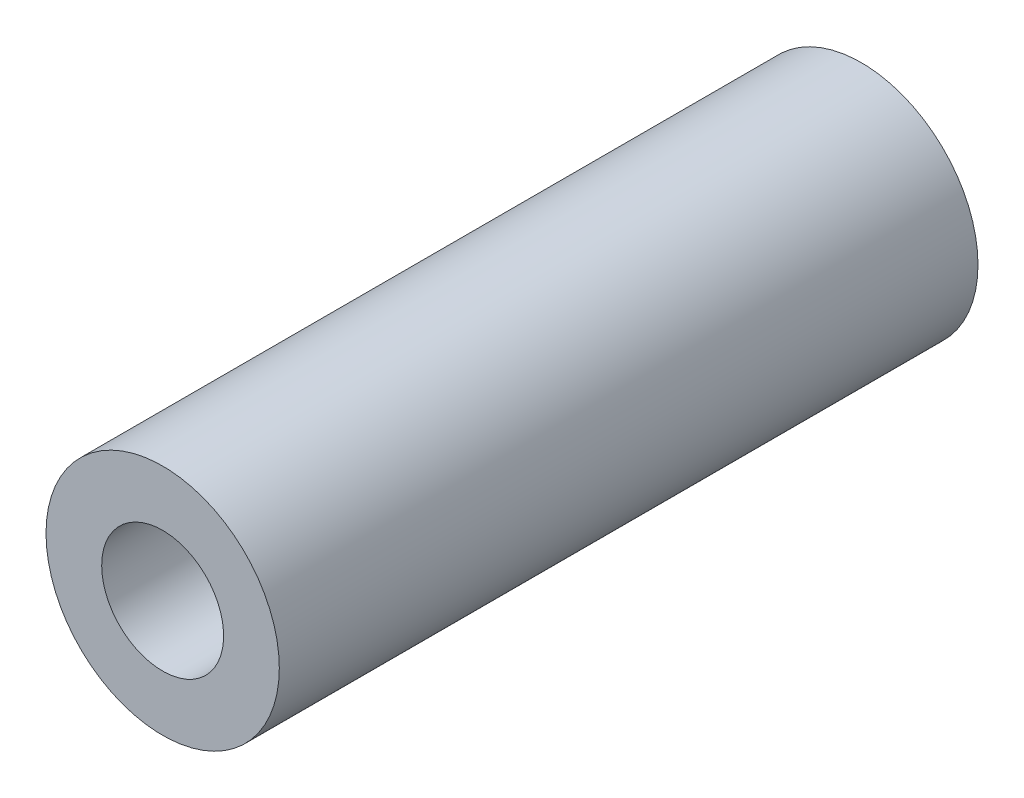
ISO-10303-21;
HEADER;
FILE_DESCRIPTION(('STEP AP214'),'2;1');
FILE_NAME('part.step','',(''),(''),'','','');
FILE_SCHEMA(('AUTOMOTIVE_DESIGN { 1 0 10303 214 1 1 1 1 }'));
ENDSEC;
DATA;
#1=APPLICATION_CONTEXT('core data for automotive mechanical design processes');
#2=APPLICATION_PROTOCOL_DEFINITION('international standard','automotive_design',2000,#1);
#3=PRODUCT_CONTEXT('',#1,'mechanical');
#4=PRODUCT('Part','Part','',(#3));
#5=PRODUCT_RELATED_PRODUCT_CATEGORY('part','',(#4));
#6=PRODUCT_DEFINITION_FORMATION('','',#4);
#7=PRODUCT_DEFINITION_CONTEXT('part definition',#1,'design');
#8=PRODUCT_DEFINITION('design','',#6,#7);
#9=PRODUCT_DEFINITION_SHAPE('','',#8);
#10=(LENGTH_UNIT() NAMED_UNIT(*) SI_UNIT(.MILLI.,.METRE.));
#11=(NAMED_UNIT(*) PLANE_ANGLE_UNIT() SI_UNIT($,.RADIAN.));
#12=(NAMED_UNIT(*) SI_UNIT($,.STERADIAN.) SOLID_ANGLE_UNIT());
#13=UNCERTAINTY_MEASURE_WITH_UNIT(LENGTH_MEASURE(1.E-05),#10,'distance_accuracy_value','');
#14=(GEOMETRIC_REPRESENTATION_CONTEXT(3) GLOBAL_UNCERTAINTY_ASSIGNED_CONTEXT((#13)) GLOBAL_UNIT_ASSIGNED_CONTEXT((#10,
#11,#12)) REPRESENTATION_CONTEXT('',''));
#15=CARTESIAN_POINT('',(0.,0.,0.));
#16=DIRECTION('',(0.,0.,1.));
#17=DIRECTION('',(1.,0.,0.));
#18=AXIS2_PLACEMENT_3D('',#15,#16,#17);
#19=CARTESIAN_POINT('',(0.,0.,14.2621));
#20=DIRECTION('',(0.,0.,1.));
#21=DIRECTION('',(1.,0.,0.));
#22=AXIS2_PLACEMENT_3D('',#19,#20,#21);
#23=PLANE('',#22);
#24=CARTESIAN_POINT('',(0.,0.,14.2621));
#25=DIRECTION('',(0.,0.,1.));
#26=DIRECTION('',(1.,0.,0.));
#27=AXIS2_PLACEMENT_3D('',#24,#25,#26);
#28=CIRCLE('',#27,4.7625);
#29=CARTESIAN_POINT('',(-4.7625,0.,14.2621));
#30=VERTEX_POINT('',#29);
#31=EDGE_CURVE('E10',#30,#30,#28,.T.);
#32=ORIENTED_EDGE('',*,*,#31,.T.);
#33=EDGE_LOOP('',(#32));
#34=FACE_BOUND('',#33,.T.);
#35=CARTESIAN_POINT('',(0.,0.,14.2621));
#36=DIRECTION('',(0.,0.,1.));
#37=DIRECTION('',(1.,0.,0.));
#38=AXIS2_PLACEMENT_3D('',#35,#36,#37);
#39=CIRCLE('',#38,2.4892);
#40=CARTESIAN_POINT('',(-2.4892,0.,14.2621));
#41=VERTEX_POINT('',#40);
#42=EDGE_CURVE('E56',#41,#41,#39,.T.);
#43=ORIENTED_EDGE('',*,*,#42,.F.);
#44=EDGE_LOOP('',(#43));
#45=FACE_BOUND('',#44,.T.);
#46=ADVANCED_FACE('F43',(#34,#45),#23,.T.);
#47=CARTESIAN_POINT('',(0.,0.,-14.2621));
#48=DIRECTION('',(0.,0.,1.));
#49=DIRECTION('',(1.,0.,0.));
#50=AXIS2_PLACEMENT_3D('',#47,#48,#49);
#51=PLANE('',#50);
#52=CARTESIAN_POINT('',(0.,0.,-14.2621));
#53=DIRECTION('',(0.,0.,1.));
#54=DIRECTION('',(1.,0.,0.));
#55=AXIS2_PLACEMENT_3D('',#52,#53,#54);
#56=CIRCLE('',#55,4.7625);
#57=CARTESIAN_POINT('',(-4.7625,0.,-14.2621));
#58=VERTEX_POINT('',#57);
#59=EDGE_CURVE('E47',#58,#58,#56,.T.);
#60=ORIENTED_EDGE('',*,*,#59,.F.);
#61=EDGE_LOOP('',(#60));
#62=FACE_BOUND('',#61,.T.);
#63=CARTESIAN_POINT('',(0.,0.,-14.2621));
#64=DIRECTION('',(0.,0.,1.));
#65=DIRECTION('',(1.,0.,0.));
#66=AXIS2_PLACEMENT_3D('',#63,#64,#65);
#67=CIRCLE('',#66,2.4892);
#68=CARTESIAN_POINT('',(-2.4892,0.,-14.2621));
#69=VERTEX_POINT('',#68);
#70=EDGE_CURVE('E58',#69,#69,#67,.T.);
#71=ORIENTED_EDGE('',*,*,#70,.T.);
#72=EDGE_LOOP('',(#71));
#73=FACE_BOUND('',#72,.T.);
#74=ADVANCED_FACE('F70',(#62,#73),#51,.F.);
#75=CARTESIAN_POINT('',(0.,0.,14.2621));
#76=DIRECTION('',(0.,0.,-1.));
#77=DIRECTION('',(-1.,0.,0.));
#78=AXIS2_PLACEMENT_3D('',#75,#76,#77);
#79=CYLINDRICAL_SURFACE('',#78,4.7625);
#80=CARTESIAN_POINT('',(-4.7625,0.,14.2621));
#81=CARTESIAN_POINT('',(-4.7625,0.,13.9649729166667));
#82=CARTESIAN_POINT('',(-4.7625,0.,13.6678458333333));
#83=CARTESIAN_POINT('',(-4.7625,0.,13.0735916666667));
#84=CARTESIAN_POINT('',(-4.7625,0.,12.7764645833333));
#85=CARTESIAN_POINT('',(-4.7625,0.,12.1822104166667));
#86=CARTESIAN_POINT('',(-4.7625,0.,11.8850833333333));
#87=CARTESIAN_POINT('',(-4.7625,0.,11.2908291666667));
#88=CARTESIAN_POINT('',(-4.7625,0.,10.9937020833333));
#89=CARTESIAN_POINT('',(-4.7625,0.,10.3994479166667));
#90=CARTESIAN_POINT('',(-4.7625,0.,10.1023208333333));
#91=CARTESIAN_POINT('',(-4.7625,0.,9.50806666666667));
#92=CARTESIAN_POINT('',(-4.7625,0.,9.21093958333333));
#93=CARTESIAN_POINT('',(-4.7625,0.,8.61668541666667));
#94=CARTESIAN_POINT('',(-4.7625,0.,8.31955833333333));
#95=CARTESIAN_POINT('',(-4.7625,0.,7.72530416666666));
#96=CARTESIAN_POINT('',(-4.7625,0.,7.42817708333333));
#97=CARTESIAN_POINT('',(-4.7625,0.,6.83392291666666));
#98=CARTESIAN_POINT('',(-4.7625,0.,6.53679583333333));
#99=CARTESIAN_POINT('',(-4.7625,0.,5.94254166666666));
#100=CARTESIAN_POINT('',(-4.7625,0.,5.64541458333333));
#101=CARTESIAN_POINT('',(-4.7625,0.,5.05116041666666));
#102=CARTESIAN_POINT('',(-4.7625,0.,4.75403333333333));
#103=CARTESIAN_POINT('',(-4.7625,0.,4.15977916666666));
#104=CARTESIAN_POINT('',(-4.7625,0.,3.86265208333333));
#105=CARTESIAN_POINT('',(-4.7625,0.,3.26839791666666));
#106=CARTESIAN_POINT('',(-4.7625,0.,2.97127083333333));
#107=CARTESIAN_POINT('',(-4.7625,0.,2.37701666666666));
#108=CARTESIAN_POINT('',(-4.7625,0.,2.07988958333333));
#109=CARTESIAN_POINT('',(-4.7625,0.,1.48563541666666));
#110=CARTESIAN_POINT('',(-4.7625,0.,1.18850833333333));
#111=CARTESIAN_POINT('',(-4.7625,0.,0.594254166666663));
#112=CARTESIAN_POINT('',(-4.7625,0.,0.29712708333333));
#113=CARTESIAN_POINT('',(-4.7625,0.,-0.297127083333337));
#114=CARTESIAN_POINT('',(-4.7625,0.,-0.59425416666667));
#115=CARTESIAN_POINT('',(-4.7625,0.,-1.18850833333334));
#116=CARTESIAN_POINT('',(-4.7625,0.,-1.48563541666667));
#117=CARTESIAN_POINT('',(-4.7625,0.,-2.07988958333333));
#118=CARTESIAN_POINT('',(-4.7625,0.,-2.37701666666667));
#119=CARTESIAN_POINT('',(-4.7625,0.,-2.97127083333333));
#120=CARTESIAN_POINT('',(-4.7625,0.,-3.26839791666667));
#121=CARTESIAN_POINT('',(-4.7625,0.,-3.86265208333333));
#122=CARTESIAN_POINT('',(-4.7625,0.,-4.15977916666667));
#123=CARTESIAN_POINT('',(-4.7625,0.,-4.75403333333333));
#124=CARTESIAN_POINT('',(-4.7625,0.,-5.05116041666667));
#125=CARTESIAN_POINT('',(-4.7625,0.,-5.64541458333333));
#126=CARTESIAN_POINT('',(-4.7625,0.,-5.94254166666667));
#127=CARTESIAN_POINT('',(-4.7625,0.,-6.53679583333333));
#128=CARTESIAN_POINT('',(-4.7625,0.,-6.83392291666667));
#129=CARTESIAN_POINT('',(-4.7625,0.,-7.42817708333334));
#130=CARTESIAN_POINT('',(-4.7625,0.,-7.72530416666667));
#131=CARTESIAN_POINT('',(-4.7625,0.,-8.31955833333334));
#132=CARTESIAN_POINT('',(-4.7625,0.,-8.61668541666667));
#133=CARTESIAN_POINT('',(-4.7625,0.,-9.21093958333334));
#134=CARTESIAN_POINT('',(-4.7625,0.,-9.50806666666667));
#135=CARTESIAN_POINT('',(-4.7625,0.,-10.1023208333333));
#136=CARTESIAN_POINT('',(-4.7625,0.,-10.3994479166667));
#137=CARTESIAN_POINT('',(-4.7625,0.,-10.9937020833333));
#138=CARTESIAN_POINT('',(-4.7625,0.,-11.2908291666667));
#139=CARTESIAN_POINT('',(-4.7625,0.,-11.8850833333333));
#140=CARTESIAN_POINT('',(-4.7625,0.,-12.1822104166667));
#141=CARTESIAN_POINT('',(-4.7625,0.,-12.7764645833333));
#142=CARTESIAN_POINT('',(-4.7625,0.,-13.0735916666667));
#143=CARTESIAN_POINT('',(-4.7625,0.,-13.6678458333333));
#144=CARTESIAN_POINT('',(-4.7625,0.,-13.9649729166667));
#145=CARTESIAN_POINT('',(-4.7625,0.,-14.2621));
#146=B_SPLINE_CURVE_WITH_KNOTS('',3,(#80,#81,#82,#83,#84,#85,#86,#87,#88,#89,#90,#91,#92,#93,
#94,#95,#96,#97,#98,#99,#100,#101,#102,#103,#104,#105,#106,#107,#108,#109,#110,#111,#112,#113,
#114,#115,#116,#117,#118,#119,#120,#121,#122,#123,#124,#125,#126,#127,#128,#129,#130,#131,#132,
#133,#134,#135,#136,#137,#138,#139,#140,#141,#142,#143,#144,#145),.UNSPECIFIED.,.F.,.F.,(4,2,2,
2,2,2,2,2,2,2,2,2,2,2,2,2,2,2,2,2,2,2,2,2,2,2,2,2,2,2,2,2,4),(0.,0.89138125,1.7827625,
2.67414375,3.565525,4.45690625,5.3482875,6.23966875,7.13105,8.02243125,8.9138125,9.80519375,
10.696575,11.58795625,12.4793375,13.37071875,14.2621,15.15348125,16.0448625,16.93624375,
17.827625,18.71900625,19.6103875,20.50176875,21.39315,22.28453125,23.1759125,24.06729375,
24.958675,25.85005625,26.7414375,27.63281875,28.5242),.UNSPECIFIED.);
#147=EDGE_CURVE('BSEAM45',#30,#58,#146,.T.);
#148=ORIENTED_EDGE('',*,*,#31,.F.);
#149=ORIENTED_EDGE('',*,*,#59,.T.);
#150=ORIENTED_EDGE('',*,*,#147,.T.);
#151=ORIENTED_EDGE('',*,*,#147,.F.);
#152=EDGE_LOOP('',(#148,#150,#149,#151));
#153=FACE_BOUND('',#152,.T.);
#154=ADVANCED_FACE('F45',(#153),#79,.T.);
#155=CARTESIAN_POINT('',(0.,0.,14.2621));
#156=DIRECTION('',(0.,0.,-1.));
#157=DIRECTION('',(-1.,0.,0.));
#158=AXIS2_PLACEMENT_3D('',#155,#156,#157);
#159=CYLINDRICAL_SURFACE('',#158,2.4892);
#160=CARTESIAN_POINT('',(-2.4892,0.,14.2621));
#161=CARTESIAN_POINT('',(-2.4892,0.,13.9649729166667));
#162=CARTESIAN_POINT('',(-2.4892,0.,13.6678458333333));
#163=CARTESIAN_POINT('',(-2.4892,0.,13.0735916666667));
#164=CARTESIAN_POINT('',(-2.4892,0.,12.7764645833333));
#165=CARTESIAN_POINT('',(-2.4892,0.,12.1822104166667));
#166=CARTESIAN_POINT('',(-2.4892,0.,11.8850833333333));
#167=CARTESIAN_POINT('',(-2.4892,0.,11.2908291666667));
#168=CARTESIAN_POINT('',(-2.4892,0.,10.9937020833333));
#169=CARTESIAN_POINT('',(-2.4892,0.,10.3994479166667));
#170=CARTESIAN_POINT('',(-2.4892,0.,10.1023208333333));
#171=CARTESIAN_POINT('',(-2.4892,0.,9.50806666666667));
#172=CARTESIAN_POINT('',(-2.4892,0.,9.21093958333333));
#173=CARTESIAN_POINT('',(-2.4892,0.,8.61668541666667));
#174=CARTESIAN_POINT('',(-2.4892,0.,8.31955833333333));
#175=CARTESIAN_POINT('',(-2.4892,0.,7.72530416666666));
#176=CARTESIAN_POINT('',(-2.4892,0.,7.42817708333333));
#177=CARTESIAN_POINT('',(-2.4892,0.,6.83392291666667));
#178=CARTESIAN_POINT('',(-2.4892,0.,6.53679583333333));
#179=CARTESIAN_POINT('',(-2.4892,0.,5.94254166666667));
#180=CARTESIAN_POINT('',(-2.4892,0.,5.64541458333333));
#181=CARTESIAN_POINT('',(-2.4892,0.,5.05116041666667));
#182=CARTESIAN_POINT('',(-2.4892,0.,4.75403333333333));
#183=CARTESIAN_POINT('',(-2.4892,0.,4.15977916666667));
#184=CARTESIAN_POINT('',(-2.4892,0.,3.86265208333333));
#185=CARTESIAN_POINT('',(-2.4892,0.,3.26839791666667));
#186=CARTESIAN_POINT('',(-2.4892,0.,2.97127083333333));
#187=CARTESIAN_POINT('',(-2.4892,0.,2.37701666666667));
#188=CARTESIAN_POINT('',(-2.4892,0.,2.07988958333333));
#189=CARTESIAN_POINT('',(-2.4892,0.,1.48563541666666));
#190=CARTESIAN_POINT('',(-2.4892,0.,1.18850833333333));
#191=CARTESIAN_POINT('',(-2.4892,0.,0.594254166666665));
#192=CARTESIAN_POINT('',(-2.4892,0.,0.297127083333332));
#193=CARTESIAN_POINT('',(-2.4892,0.,-0.297127083333335));
#194=CARTESIAN_POINT('',(-2.4892,0.,-0.594254166666668));
#195=CARTESIAN_POINT('',(-2.4892,0.,-1.18850833333333));
#196=CARTESIAN_POINT('',(-2.4892,0.,-1.48563541666667));
#197=CARTESIAN_POINT('',(-2.4892,0.,-2.07988958333333));
#198=CARTESIAN_POINT('',(-2.4892,0.,-2.37701666666667));
#199=CARTESIAN_POINT('',(-2.4892,0.,-2.97127083333333));
#200=CARTESIAN_POINT('',(-2.4892,0.,-3.26839791666667));
#201=CARTESIAN_POINT('',(-2.4892,0.,-3.86265208333333));
#202=CARTESIAN_POINT('',(-2.4892,0.,-4.15977916666667));
#203=CARTESIAN_POINT('',(-2.4892,0.,-4.75403333333333));
#204=CARTESIAN_POINT('',(-2.4892,0.,-5.05116041666667));
#205=CARTESIAN_POINT('',(-2.4892,0.,-5.64541458333333));
#206=CARTESIAN_POINT('',(-2.4892,0.,-5.94254166666667));
#207=CARTESIAN_POINT('',(-2.4892,0.,-6.53679583333333));
#208=CARTESIAN_POINT('',(-2.4892,0.,-6.83392291666667));
#209=CARTESIAN_POINT('',(-2.4892,0.,-7.42817708333334));
#210=CARTESIAN_POINT('',(-2.4892,0.,-7.72530416666667));
#211=CARTESIAN_POINT('',(-2.4892,0.,-8.31955833333334));
#212=CARTESIAN_POINT('',(-2.4892,0.,-8.61668541666667));
#213=CARTESIAN_POINT('',(-2.4892,0.,-9.21093958333334));
#214=CARTESIAN_POINT('',(-2.4892,0.,-9.50806666666667));
#215=CARTESIAN_POINT('',(-2.4892,0.,-10.1023208333333));
#216=CARTESIAN_POINT('',(-2.4892,0.,-10.3994479166667));
#217=CARTESIAN_POINT('',(-2.4892,0.,-10.9937020833333));
#218=CARTESIAN_POINT('',(-2.4892,0.,-11.2908291666667));
#219=CARTESIAN_POINT('',(-2.4892,0.,-11.8850833333333));
#220=CARTESIAN_POINT('',(-2.4892,0.,-12.1822104166667));
#221=CARTESIAN_POINT('',(-2.4892,0.,-12.7764645833333));
#222=CARTESIAN_POINT('',(-2.4892,0.,-13.0735916666667));
#223=CARTESIAN_POINT('',(-2.4892,0.,-13.6678458333333));
#224=CARTESIAN_POINT('',(-2.4892,0.,-13.9649729166667));
#225=CARTESIAN_POINT('',(-2.4892,0.,-14.2621));
#226=B_SPLINE_CURVE_WITH_KNOTS('',3,(#160,#161,#162,#163,#164,#165,#166,#167,#168,#169,#170,
#171,#172,#173,#174,#175,#176,#177,#178,#179,#180,#181,#182,#183,#184,#185,#186,#187,#188,#189,
#190,#191,#192,#193,#194,#195,#196,#197,#198,#199,#200,#201,#202,#203,#204,#205,#206,#207,#208,
#209,#210,#211,#212,#213,#214,#215,#216,#217,#218,#219,#220,#221,#222,#223,#224,#225),
.UNSPECIFIED.,.F.,.F.,(4,2,2,2,2,2,2,2,2,2,2,2,2,2,2,2,2,2,2,2,2,2,2,2,2,2,2,2,2,2,2,2,4),(0.,
0.891381250000002,1.7827625,2.67414375,3.565525,4.45690625,5.3482875,6.23966875,7.13105,
8.02243125,8.9138125,9.80519375,10.696575,11.58795625,12.4793375,13.37071875,14.2621,
15.15348125,16.0448625,16.93624375,17.827625,18.71900625,19.6103875,20.50176875,21.39315,
22.28453125,23.1759125,24.06729375,24.958675,25.85005625,26.7414375,27.63281875,28.5242),.UNSPECIFIED.);
#227=EDGE_CURVE('BSEAM66',#41,#69,#226,.T.);
#228=ORIENTED_EDGE('',*,*,#42,.T.);
#229=ORIENTED_EDGE('',*,*,#70,.F.);
#230=ORIENTED_EDGE('',*,*,#227,.T.);
#231=ORIENTED_EDGE('',*,*,#227,.F.);
#232=EDGE_LOOP('',(#228,#230,#229,#231));
#233=FACE_BOUND('',#232,.T.);
#234=ADVANCED_FACE('F66',(#233),#159,.F.);
#235=CLOSED_SHELL('',(#46,#74,#154,#234));
#236=MANIFOLD_SOLID_BREP('B2',#235);
#237=ADVANCED_BREP_SHAPE_REPRESENTATION('',(#18,#236),#14);
#238=SHAPE_DEFINITION_REPRESENTATION(#9,#237);
ENDSEC;
END-ISO-10303-21;
